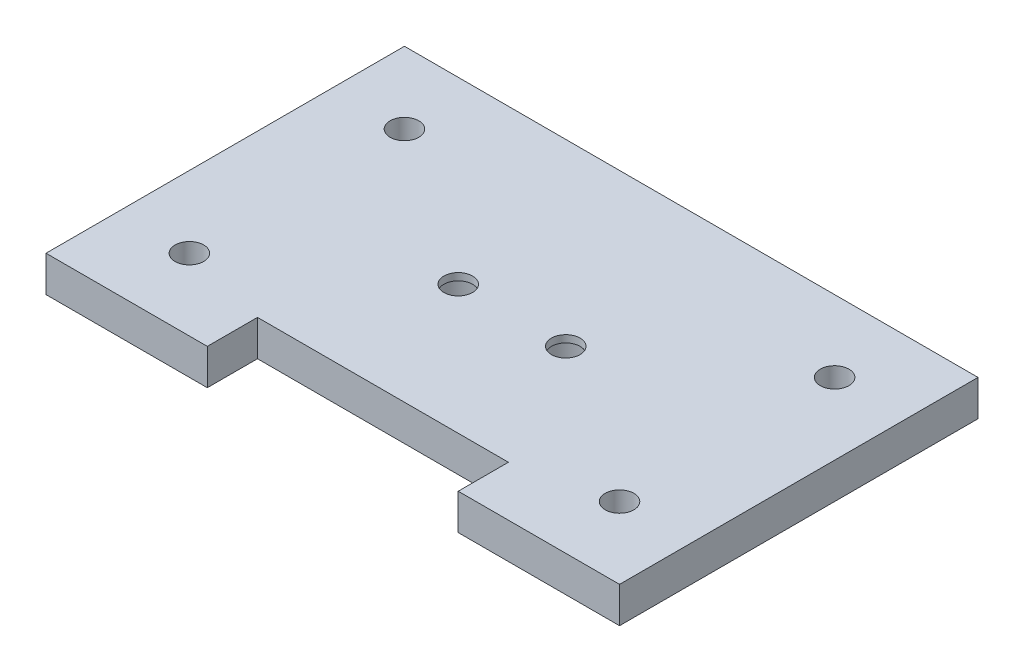
ISO-10303-21;
HEADER;
FILE_DESCRIPTION(('STEP AP214'),'2;1');
FILE_NAME('part.step','',(''),(''),'','','');
FILE_SCHEMA(('AUTOMOTIVE_DESIGN { 1 0 10303 214 1 1 1 1 }'));
ENDSEC;
DATA;
#1=APPLICATION_CONTEXT('core data for automotive mechanical design processes');
#2=APPLICATION_PROTOCOL_DEFINITION('international standard','automotive_design',2000,#1);
#3=PRODUCT_CONTEXT('',#1,'mechanical');
#4=PRODUCT('Part','Part','',(#3));
#5=PRODUCT_RELATED_PRODUCT_CATEGORY('part','',(#4));
#6=PRODUCT_DEFINITION_FORMATION('','',#4);
#7=PRODUCT_DEFINITION_CONTEXT('part definition',#1,'design');
#8=PRODUCT_DEFINITION('design','',#6,#7);
#9=PRODUCT_DEFINITION_SHAPE('','',#8);
#10=(LENGTH_UNIT() NAMED_UNIT(*) SI_UNIT(.MILLI.,.METRE.));
#11=(NAMED_UNIT(*) PLANE_ANGLE_UNIT() SI_UNIT($,.RADIAN.));
#12=(NAMED_UNIT(*) SI_UNIT($,.STERADIAN.) SOLID_ANGLE_UNIT());
#13=UNCERTAINTY_MEASURE_WITH_UNIT(LENGTH_MEASURE(1.E-05),#10,'distance_accuracy_value','');
#14=(GEOMETRIC_REPRESENTATION_CONTEXT(3) GLOBAL_UNCERTAINTY_ASSIGNED_CONTEXT((#13)) GLOBAL_UNIT_ASSIGNED_CONTEXT((#10,
#11,#12)) REPRESENTATION_CONTEXT('',''));
#15=CARTESIAN_POINT('',(0.,0.,0.));
#16=DIRECTION('',(0.,0.,1.));
#17=DIRECTION('',(1.,0.,0.));
#18=AXIS2_PLACEMENT_3D('',#15,#16,#17);
#19=CARTESIAN_POINT('',(-17.5000000000002,5.,1.38777878078146E-13));
#20=DIRECTION('',(-1.,0.,0.));
#21=DIRECTION('',(0.,0.,1.));
#22=AXIS2_PLACEMENT_3D('',#19,#20,#21);
#23=PLANE('',#22);
#24=DIRECTION('',(0.,0.,-1.));
#25=VECTOR('',#24,1.);
#26=CARTESIAN_POINT('',(-17.5000000000002,0.,1.38777878078146E-13));
#27=LINE('',#26,#25);
#28=CARTESIAN_POINT('',(-17.5,0.,25.));
#29=VERTEX_POINT('',#28);
#30=CARTESIAN_POINT('',(-17.5,0.,18.));
#31=VERTEX_POINT('',#30);
#32=EDGE_CURVE('E152',#29,#31,#27,.T.);
#33=ORIENTED_EDGE('',*,*,#32,.T.);
#34=DIRECTION('',(0.,-1.,0.));
#35=VECTOR('',#34,1.);
#36=CARTESIAN_POINT('',(-17.5,5.,18.));
#37=LINE('',#36,#35);
#38=CARTESIAN_POINT('',(-17.5,5.,18.));
#39=VERTEX_POINT('',#38);
#40=EDGE_CURVE('E11',#39,#31,#37,.T.);
#41=ORIENTED_EDGE('',*,*,#40,.F.);
#42=DIRECTION('',(0.,0.,-1.));
#43=VECTOR('',#42,1.);
#44=CARTESIAN_POINT('',(-17.5000000000002,5.,1.38777878078146E-13));
#45=LINE('',#44,#43);
#46=CARTESIAN_POINT('',(-17.5,5.,25.));
#47=VERTEX_POINT('',#46);
#48=EDGE_CURVE('E214',#47,#39,#45,.T.);
#49=ORIENTED_EDGE('',*,*,#48,.F.);
#50=DIRECTION('',(0.,-1.,0.));
#51=VECTOR('',#50,1.);
#52=CARTESIAN_POINT('',(-17.5,5.,25.));
#53=LINE('',#52,#51);
#54=EDGE_CURVE('E169',#47,#29,#53,.T.);
#55=ORIENTED_EDGE('',*,*,#54,.T.);
#56=EDGE_LOOP('',(#33,#41,#49,#55));
#57=FACE_BOUND('',#56,.T.);
#58=ADVANCED_FACE('F41',(#57),#23,.F.);
#59=CARTESIAN_POINT('',(0.,5.,18.));
#60=DIRECTION('',(0.,0.,-1.));
#61=DIRECTION('',(-1.,0.,0.));
#62=AXIS2_PLACEMENT_3D('',#59,#60,#61);
#63=PLANE('',#62);
#64=DIRECTION('',(1.,0.,0.));
#65=VECTOR('',#64,1.);
#66=CARTESIAN_POINT('',(0.,0.,18.));
#67=LINE('',#66,#65);
#68=CARTESIAN_POINT('',(17.5,0.,18.));
#69=VERTEX_POINT('',#68);
#70=EDGE_CURVE('E155',#31,#69,#67,.T.);
#71=ORIENTED_EDGE('',*,*,#70,.T.);
#72=DIRECTION('',(0.,-1.,0.));
#73=VECTOR('',#72,1.);
#74=CARTESIAN_POINT('',(17.5,5.,18.));
#75=LINE('',#74,#73);
#76=CARTESIAN_POINT('',(17.5,5.,18.));
#77=VERTEX_POINT('',#76);
#78=EDGE_CURVE('E51',#77,#69,#75,.T.);
#79=ORIENTED_EDGE('',*,*,#78,.F.);
#80=DIRECTION('',(1.,0.,0.));
#81=VECTOR('',#80,1.);
#82=CARTESIAN_POINT('',(0.,5.,18.));
#83=LINE('',#82,#81);
#84=EDGE_CURVE('E102',#39,#77,#83,.T.);
#85=ORIENTED_EDGE('',*,*,#84,.F.);
#86=ORIENTED_EDGE('',*,*,#40,.T.);
#87=EDGE_LOOP('',(#71,#79,#85,#86));
#88=FACE_BOUND('',#87,.T.);
#89=ADVANCED_FACE('F249',(#88),#63,.F.);
#90=CARTESIAN_POINT('',(17.5,5.,0.));
#91=DIRECTION('',(-1.,0.,0.));
#92=DIRECTION('',(0.,0.,1.));
#93=AXIS2_PLACEMENT_3D('',#90,#91,#92);
#94=PLANE('',#93);
#95=DIRECTION('',(0.,0.,-1.));
#96=VECTOR('',#95,1.);
#97=CARTESIAN_POINT('',(17.5,0.,0.));
#98=LINE('',#97,#96);
#99=CARTESIAN_POINT('',(17.5,0.,25.));
#100=VERTEX_POINT('',#99);
#101=EDGE_CURVE('E158',#100,#69,#98,.T.);
#102=ORIENTED_EDGE('',*,*,#101,.F.);
#103=DIRECTION('',(0.,-1.,0.));
#104=VECTOR('',#103,1.);
#105=CARTESIAN_POINT('',(17.5,5.,25.));
#106=LINE('',#105,#104);
#107=CARTESIAN_POINT('',(17.5,5.,25.));
#108=VERTEX_POINT('',#107);
#109=EDGE_CURVE('E175',#108,#100,#106,.T.);
#110=ORIENTED_EDGE('',*,*,#109,.F.);
#111=DIRECTION('',(0.,0.,-1.));
#112=VECTOR('',#111,1.);
#113=CARTESIAN_POINT('',(17.5,5.,0.));
#114=LINE('',#113,#112);
#115=EDGE_CURVE('E217',#108,#77,#114,.T.);
#116=ORIENTED_EDGE('',*,*,#115,.T.);
#117=ORIENTED_EDGE('',*,*,#78,.T.);
#118=EDGE_LOOP('',(#102,#110,#116,#117));
#119=FACE_BOUND('',#118,.T.);
#120=ADVANCED_FACE('F247',(#119),#94,.T.);
#121=CARTESIAN_POINT('',(0.,5.,25.));
#122=DIRECTION('',(0.,0.,-1.));
#123=DIRECTION('',(-1.,0.,0.));
#124=AXIS2_PLACEMENT_3D('',#121,#122,#123);
#125=PLANE('',#124);
#126=DIRECTION('',(1.,0.,0.));
#127=VECTOR('',#126,1.);
#128=CARTESIAN_POINT('',(0.,0.,25.));
#129=LINE('',#128,#127);
#130=CARTESIAN_POINT('',(40.,0.,25.));
#131=VERTEX_POINT('',#130);
#132=EDGE_CURVE('E161',#100,#131,#129,.T.);
#133=ORIENTED_EDGE('',*,*,#132,.T.);
#134=DIRECTION('',(0.,-1.,0.));
#135=VECTOR('',#134,1.);
#136=CARTESIAN_POINT('',(40.,5.,25.));
#137=LINE('',#136,#135);
#138=CARTESIAN_POINT('',(40.,5.,25.));
#139=VERTEX_POINT('',#138);
#140=EDGE_CURVE('E173',#139,#131,#137,.T.);
#141=ORIENTED_EDGE('',*,*,#140,.F.);
#142=DIRECTION('',(1.,0.,0.));
#143=VECTOR('',#142,1.);
#144=CARTESIAN_POINT('',(0.,5.,25.));
#145=LINE('',#144,#143);
#146=EDGE_CURVE('E135',#108,#139,#145,.T.);
#147=ORIENTED_EDGE('',*,*,#146,.F.);
#148=ORIENTED_EDGE('',*,*,#109,.T.);
#149=EDGE_LOOP('',(#133,#141,#147,#148));
#150=FACE_BOUND('',#149,.T.);
#151=ADVANCED_FACE('F223',(#150),#125,.F.);
#152=CARTESIAN_POINT('',(40.,5.,0.));
#153=DIRECTION('',(1.,0.,0.));
#154=DIRECTION('',(0.,0.,-1.));
#155=AXIS2_PLACEMENT_3D('',#152,#153,#154);
#156=PLANE('',#155);
#157=DIRECTION('',(0.,0.,1.));
#158=VECTOR('',#157,1.);
#159=CARTESIAN_POINT('',(40.,0.,0.));
#160=LINE('',#159,#158);
#161=CARTESIAN_POINT('',(40.,0.,-25.));
#162=VERTEX_POINT('',#161);
#163=EDGE_CURVE('E164',#162,#131,#160,.T.);
#164=ORIENTED_EDGE('',*,*,#163,.F.);
#165=DIRECTION('',(0.,-1.,0.));
#166=VECTOR('',#165,1.);
#167=CARTESIAN_POINT('',(40.,5.,-25.));
#168=LINE('',#167,#166);
#169=CARTESIAN_POINT('',(40.,5.,-25.));
#170=VERTEX_POINT('',#169);
#171=EDGE_CURVE('E124',#170,#162,#168,.T.);
#172=ORIENTED_EDGE('',*,*,#171,.F.);
#173=DIRECTION('',(0.,0.,1.));
#174=VECTOR('',#173,1.);
#175=CARTESIAN_POINT('',(40.,5.,0.));
#176=LINE('',#175,#174);
#177=EDGE_CURVE('E133',#170,#139,#176,.T.);
#178=ORIENTED_EDGE('',*,*,#177,.T.);
#179=ORIENTED_EDGE('',*,*,#140,.T.);
#180=EDGE_LOOP('',(#164,#172,#178,#179));
#181=FACE_BOUND('',#180,.T.);
#182=ADVANCED_FACE('F227',(#181),#156,.T.);
#183=CARTESIAN_POINT('',(0.,5.,-25.));
#184=DIRECTION('',(0.,0.,-1.));
#185=DIRECTION('',(-1.,0.,0.));
#186=AXIS2_PLACEMENT_3D('',#183,#184,#185);
#187=PLANE('',#186);
#188=DIRECTION('',(1.,0.,0.));
#189=VECTOR('',#188,1.);
#190=CARTESIAN_POINT('',(0.,0.,-25.));
#191=LINE('',#190,#189);
#192=CARTESIAN_POINT('',(-40.,0.,-25.));
#193=VERTEX_POINT('',#192);
#194=EDGE_CURVE('E123',#193,#162,#191,.T.);
#195=ORIENTED_EDGE('',*,*,#194,.F.);
#196=DIRECTION('',(0.,-1.,0.));
#197=VECTOR('',#196,1.);
#198=CARTESIAN_POINT('',(-40.,5.,-25.));
#199=LINE('',#198,#197);
#200=CARTESIAN_POINT('',(-40.,5.,-25.));
#201=VERTEX_POINT('',#200);
#202=EDGE_CURVE('E117',#201,#193,#199,.T.);
#203=ORIENTED_EDGE('',*,*,#202,.F.);
#204=DIRECTION('',(1.,0.,0.));
#205=VECTOR('',#204,1.);
#206=CARTESIAN_POINT('',(0.,5.,-25.));
#207=LINE('',#206,#205);
#208=EDGE_CURVE('E121',#201,#170,#207,.T.);
#209=ORIENTED_EDGE('',*,*,#208,.T.);
#210=ORIENTED_EDGE('',*,*,#171,.T.);
#211=EDGE_LOOP('',(#195,#203,#209,#210));
#212=FACE_BOUND('',#211,.T.);
#213=ADVANCED_FACE('F119',(#212),#187,.T.);
#214=CARTESIAN_POINT('',(-40.,5.,0.));
#215=DIRECTION('',(1.,0.,0.));
#216=DIRECTION('',(0.,0.,-1.));
#217=AXIS2_PLACEMENT_3D('',#214,#215,#216);
#218=PLANE('',#217);
#219=DIRECTION('',(0.,0.,1.));
#220=VECTOR('',#219,1.);
#221=CARTESIAN_POINT('',(-40.,0.,0.));
#222=LINE('',#221,#220);
#223=CARTESIAN_POINT('',(-40.,0.,25.));
#224=VERTEX_POINT('',#223);
#225=EDGE_CURVE('E88',#193,#224,#222,.T.);
#226=ORIENTED_EDGE('',*,*,#225,.T.);
#227=DIRECTION('',(0.,-1.,0.));
#228=VECTOR('',#227,1.);
#229=CARTESIAN_POINT('',(-40.,5.,25.));
#230=LINE('',#229,#228);
#231=CARTESIAN_POINT('',(-40.,5.,25.));
#232=VERTEX_POINT('',#231);
#233=EDGE_CURVE('E125',#232,#224,#230,.T.);
#234=ORIENTED_EDGE('',*,*,#233,.F.);
#235=DIRECTION('',(0.,0.,1.));
#236=VECTOR('',#235,1.);
#237=CARTESIAN_POINT('',(-40.,5.,0.));
#238=LINE('',#237,#236);
#239=EDGE_CURVE('E127',#201,#232,#238,.T.);
#240=ORIENTED_EDGE('',*,*,#239,.F.);
#241=ORIENTED_EDGE('',*,*,#202,.T.);
#242=EDGE_LOOP('',(#226,#234,#240,#241));
#243=FACE_BOUND('',#242,.T.);
#244=ADVANCED_FACE('F128',(#243),#218,.F.);
#245=CARTESIAN_POINT('',(-30.,5.,-15.));
#246=DIRECTION('',(0.,-1.,0.));
#247=DIRECTION('',(0.,0.,-1.));
#248=AXIS2_PLACEMENT_3D('',#245,#246,#247);
#249=CYLINDRICAL_SURFACE('',#248,2.);
#250=CARTESIAN_POINT('',(-30.,5.,-15.));
#251=DIRECTION('',(0.,1.,0.));
#252=DIRECTION('',(0.,0.,1.));
#253=AXIS2_PLACEMENT_3D('',#250,#251,#252);
#254=CIRCLE('',#253,2.);
#255=CARTESIAN_POINT('',(-30.,5.,-13.));
#256=VERTEX_POINT('',#255);
#257=EDGE_CURVE('E211',#256,#256,#254,.T.);
#258=ORIENTED_EDGE('',*,*,#257,.T.);
#259=EDGE_LOOP('',(#258));
#260=FACE_BOUND('',#259,.T.);
#261=CARTESIAN_POINT('',(-30.,0.,-15.));
#262=DIRECTION('',(0.,1.,0.));
#263=DIRECTION('',(0.,0.,1.));
#264=AXIS2_PLACEMENT_3D('',#261,#262,#263);
#265=CIRCLE('',#264,2.);
#266=CARTESIAN_POINT('',(-30.,0.,-13.));
#267=VERTEX_POINT('',#266);
#268=EDGE_CURVE('E149',#267,#267,#265,.T.);
#269=ORIENTED_EDGE('',*,*,#268,.F.);
#270=EDGE_LOOP('',(#269));
#271=FACE_BOUND('',#270,.T.);
#272=ADVANCED_FACE('F257',(#260,#271),#249,.F.);
#273=CARTESIAN_POINT('',(30.,5.,-15.));
#274=DIRECTION('',(0.,-1.,0.));
#275=DIRECTION('',(0.,0.,-1.));
#276=AXIS2_PLACEMENT_3D('',#273,#274,#275);
#277=CYLINDRICAL_SURFACE('',#276,2.);
#278=CARTESIAN_POINT('',(30.,5.,-15.));
#279=DIRECTION('',(0.,1.,0.));
#280=DIRECTION('',(0.,0.,1.));
#281=AXIS2_PLACEMENT_3D('',#278,#279,#280);
#282=CIRCLE('',#281,2.);
#283=CARTESIAN_POINT('',(30.,5.,-13.));
#284=VERTEX_POINT('',#283);
#285=EDGE_CURVE('E208',#284,#284,#282,.T.);
#286=ORIENTED_EDGE('',*,*,#285,.T.);
#287=EDGE_LOOP('',(#286));
#288=FACE_BOUND('',#287,.T.);
#289=CARTESIAN_POINT('',(30.,0.,-15.));
#290=DIRECTION('',(0.,1.,0.));
#291=DIRECTION('',(0.,0.,1.));
#292=AXIS2_PLACEMENT_3D('',#289,#290,#291);
#293=CIRCLE('',#292,2.);
#294=CARTESIAN_POINT('',(30.,0.,-13.));
#295=VERTEX_POINT('',#294);
#296=EDGE_CURVE('E146',#295,#295,#293,.T.);
#297=ORIENTED_EDGE('',*,*,#296,.F.);
#298=EDGE_LOOP('',(#297));
#299=FACE_BOUND('',#298,.T.);
#300=ADVANCED_FACE('F260',(#288,#299),#277,.F.);
#301=CARTESIAN_POINT('',(30.,5.,15.));
#302=DIRECTION('',(0.,-1.,0.));
#303=DIRECTION('',(0.,0.,-1.));
#304=AXIS2_PLACEMENT_3D('',#301,#302,#303);
#305=CYLINDRICAL_SURFACE('',#304,2.);
#306=CARTESIAN_POINT('',(30.,5.,15.));
#307=DIRECTION('',(0.,1.,0.));
#308=DIRECTION('',(0.,0.,1.));
#309=AXIS2_PLACEMENT_3D('',#306,#307,#308);
#310=CIRCLE('',#309,2.);
#311=CARTESIAN_POINT('',(30.,5.,17.));
#312=VERTEX_POINT('',#311);
#313=EDGE_CURVE('E205',#312,#312,#310,.T.);
#314=ORIENTED_EDGE('',*,*,#313,.T.);
#315=EDGE_LOOP('',(#314));
#316=FACE_BOUND('',#315,.T.);
#317=CARTESIAN_POINT('',(30.,0.,15.));
#318=DIRECTION('',(0.,1.,0.));
#319=DIRECTION('',(0.,0.,1.));
#320=AXIS2_PLACEMENT_3D('',#317,#318,#319);
#321=CIRCLE('',#320,2.);
#322=CARTESIAN_POINT('',(30.,0.,17.));
#323=VERTEX_POINT('',#322);
#324=EDGE_CURVE('E142',#323,#323,#321,.T.);
#325=ORIENTED_EDGE('',*,*,#324,.F.);
#326=EDGE_LOOP('',(#325));
#327=FACE_BOUND('',#326,.T.);
#328=ADVANCED_FACE('F242',(#316,#327),#305,.F.);
#329=CARTESIAN_POINT('',(-30.,5.,15.));
#330=DIRECTION('',(0.,-1.,0.));
#331=DIRECTION('',(0.,0.,-1.));
#332=AXIS2_PLACEMENT_3D('',#329,#330,#331);
#333=CYLINDRICAL_SURFACE('',#332,2.);
#334=CARTESIAN_POINT('',(-30.,5.,15.));
#335=DIRECTION('',(0.,1.,0.));
#336=DIRECTION('',(0.,0.,1.));
#337=AXIS2_PLACEMENT_3D('',#334,#335,#336);
#338=CIRCLE('',#337,2.);
#339=CARTESIAN_POINT('',(-30.,5.,17.));
#340=VERTEX_POINT('',#339);
#341=EDGE_CURVE('E202',#340,#340,#338,.T.);
#342=ORIENTED_EDGE('',*,*,#341,.T.);
#343=EDGE_LOOP('',(#342));
#344=FACE_BOUND('',#343,.T.);
#345=CARTESIAN_POINT('',(-30.,0.,15.));
#346=DIRECTION('',(0.,1.,0.));
#347=DIRECTION('',(0.,0.,1.));
#348=AXIS2_PLACEMENT_3D('',#345,#346,#347);
#349=CIRCLE('',#348,2.);
#350=CARTESIAN_POINT('',(-30.,0.,17.));
#351=VERTEX_POINT('',#350);
#352=EDGE_CURVE('E139',#351,#351,#349,.T.);
#353=ORIENTED_EDGE('',*,*,#352,.F.);
#354=EDGE_LOOP('',(#353));
#355=FACE_BOUND('',#354,.T.);
#356=ADVANCED_FACE('F43',(#344,#355),#333,.F.);
#357=EDGE_CURVE('E94',#224,#29,#129,.T.);
#358=ORIENTED_EDGE('',*,*,#357,.T.);
#359=ORIENTED_EDGE('',*,*,#54,.F.);
#360=EDGE_CURVE('E60',#232,#47,#145,.T.);
#361=ORIENTED_EDGE('',*,*,#360,.F.);
#362=ORIENTED_EDGE('',*,*,#233,.T.);
#363=EDGE_LOOP('',(#358,#359,#361,#362));
#364=FACE_BOUND('',#363,.T.);
#365=ADVANCED_FACE('F234',(#364),#125,.F.);
#366=CARTESIAN_POINT('',(0.,5.,0.));
#367=DIRECTION('',(0.,1.,0.));
#368=DIRECTION('',(0.,0.,1.));
#369=AXIS2_PLACEMENT_3D('',#366,#367,#368);
#370=PLANE('',#369);
#371=CARTESIAN_POINT('',(-7.5,5.,0.));
#372=DIRECTION('',(0.,-1.,0.));
#373=DIRECTION('',(0.,0.,-1.));
#374=AXIS2_PLACEMENT_3D('',#371,#372,#373);
#375=CIRCLE('',#374,2.);
#376=CARTESIAN_POINT('',(-7.5,5.,-2.));
#377=VERTEX_POINT('',#376);
#378=EDGE_CURVE('E179',#377,#377,#375,.T.);
#379=ORIENTED_EDGE('',*,*,#378,.T.);
#380=EDGE_LOOP('',(#379));
#381=FACE_BOUND('',#380,.T.);
#382=CARTESIAN_POINT('',(7.5,5.,0.));
#383=DIRECTION('',(0.,-1.,0.));
#384=DIRECTION('',(0.,0.,-1.));
#385=AXIS2_PLACEMENT_3D('',#382,#383,#384);
#386=CIRCLE('',#385,2.);
#387=CARTESIAN_POINT('',(7.5,5.,-2.));
#388=VERTEX_POINT('',#387);
#389=EDGE_CURVE('E185',#388,#388,#386,.T.);
#390=ORIENTED_EDGE('',*,*,#389,.T.);
#391=EDGE_LOOP('',(#390));
#392=FACE_BOUND('',#391,.T.);
#393=ORIENTED_EDGE('',*,*,#341,.F.);
#394=EDGE_LOOP('',(#393));
#395=FACE_BOUND('',#394,.T.);
#396=ORIENTED_EDGE('',*,*,#313,.F.);
#397=EDGE_LOOP('',(#396));
#398=FACE_BOUND('',#397,.T.);
#399=ORIENTED_EDGE('',*,*,#285,.F.);
#400=EDGE_LOOP('',(#399));
#401=FACE_BOUND('',#400,.T.);
#402=ORIENTED_EDGE('',*,*,#257,.F.);
#403=EDGE_LOOP('',(#402));
#404=FACE_BOUND('',#403,.T.);
#405=ORIENTED_EDGE('',*,*,#48,.T.);
#406=ORIENTED_EDGE('',*,*,#84,.T.);
#407=ORIENTED_EDGE('',*,*,#115,.F.);
#408=ORIENTED_EDGE('',*,*,#146,.T.);
#409=ORIENTED_EDGE('',*,*,#177,.F.);
#410=ORIENTED_EDGE('',*,*,#208,.F.);
#411=ORIENTED_EDGE('',*,*,#239,.T.);
#412=ORIENTED_EDGE('',*,*,#360,.T.);
#413=EDGE_LOOP('',(#405,#406,#407,#408,#409,#410,#411,#412));
#414=FACE_BOUND('',#413,.T.);
#415=ADVANCED_FACE('F131',(#381,#392,#395,#398,#401,#404,#414),#370,.T.);
#416=CARTESIAN_POINT('',(0.,0.,0.));
#417=DIRECTION('',(0.,1.,0.));
#418=DIRECTION('',(0.,0.,1.));
#419=AXIS2_PLACEMENT_3D('',#416,#417,#418);
#420=PLANE('',#419);
#421=CARTESIAN_POINT('',(-7.5,0.,0.));
#422=DIRECTION('',(0.,-1.,0.));
#423=DIRECTION('',(0.,0.,-1.));
#424=AXIS2_PLACEMENT_3D('',#421,#422,#423);
#425=CIRCLE('',#424,4.);
#426=CARTESIAN_POINT('',(-7.5,0.,-4.));
#427=VERTEX_POINT('',#426);
#428=EDGE_CURVE('E194',#427,#427,#425,.T.);
#429=ORIENTED_EDGE('',*,*,#428,.F.);
#430=EDGE_LOOP('',(#429));
#431=FACE_BOUND('',#430,.T.);
#432=CARTESIAN_POINT('',(7.5,0.,0.));
#433=DIRECTION('',(0.,-1.,0.));
#434=DIRECTION('',(0.,0.,-1.));
#435=AXIS2_PLACEMENT_3D('',#432,#433,#434);
#436=CIRCLE('',#435,4.);
#437=CARTESIAN_POINT('',(7.5,0.,-4.));
#438=VERTEX_POINT('',#437);
#439=EDGE_CURVE('E183',#438,#438,#436,.T.);
#440=ORIENTED_EDGE('',*,*,#439,.F.);
#441=EDGE_LOOP('',(#440));
#442=FACE_BOUND('',#441,.T.);
#443=ORIENTED_EDGE('',*,*,#352,.T.);
#444=EDGE_LOOP('',(#443));
#445=FACE_BOUND('',#444,.T.);
#446=ORIENTED_EDGE('',*,*,#324,.T.);
#447=EDGE_LOOP('',(#446));
#448=FACE_BOUND('',#447,.T.);
#449=ORIENTED_EDGE('',*,*,#296,.T.);
#450=EDGE_LOOP('',(#449));
#451=FACE_BOUND('',#450,.T.);
#452=ORIENTED_EDGE('',*,*,#268,.T.);
#453=EDGE_LOOP('',(#452));
#454=FACE_BOUND('',#453,.T.);
#455=ORIENTED_EDGE('',*,*,#32,.F.);
#456=ORIENTED_EDGE('',*,*,#357,.F.);
#457=ORIENTED_EDGE('',*,*,#225,.F.);
#458=ORIENTED_EDGE('',*,*,#194,.T.);
#459=ORIENTED_EDGE('',*,*,#163,.T.);
#460=ORIENTED_EDGE('',*,*,#132,.F.);
#461=ORIENTED_EDGE('',*,*,#101,.T.);
#462=ORIENTED_EDGE('',*,*,#70,.F.);
#463=EDGE_LOOP('',(#455,#456,#457,#458,#459,#460,#461,#462));
#464=FACE_BOUND('',#463,.T.);
#465=ADVANCED_FACE('F230',(#431,#442,#445,#448,#451,#454,#464),#420,.F.);
#466=CARTESIAN_POINT('',(7.5,4.,0.));
#467=DIRECTION('',(0.,-1.,0.));
#468=DIRECTION('',(0.,0.,-1.));
#469=AXIS2_PLACEMENT_3D('',#466,#467,#468);
#470=CYLINDRICAL_SURFACE('',#469,4.);
#471=CARTESIAN_POINT('',(7.5,4.,0.));
#472=DIRECTION('',(0.,-1.,0.));
#473=DIRECTION('',(0.,0.,-1.));
#474=AXIS2_PLACEMENT_3D('',#471,#472,#473);
#475=CIRCLE('',#474,4.);
#476=CARTESIAN_POINT('',(7.5,4.,-4.));
#477=VERTEX_POINT('',#476);
#478=EDGE_CURVE('E197',#477,#477,#475,.T.);
#479=ORIENTED_EDGE('',*,*,#478,.F.);
#480=EDGE_LOOP('',(#479));
#481=FACE_BOUND('',#480,.T.);
#482=ORIENTED_EDGE('',*,*,#439,.T.);
#483=EDGE_LOOP('',(#482));
#484=FACE_BOUND('',#483,.T.);
#485=ADVANCED_FACE('F274',(#481,#484),#470,.F.);
#486=CARTESIAN_POINT('',(0.,4.,0.));
#487=DIRECTION('',(0.,-1.,0.));
#488=DIRECTION('',(0.,0.,-1.));
#489=AXIS2_PLACEMENT_3D('',#486,#487,#488);
#490=PLANE('',#489);
#491=CARTESIAN_POINT('',(7.5,4.,0.));
#492=DIRECTION('',(0.,-1.,0.));
#493=DIRECTION('',(0.,0.,-1.));
#494=AXIS2_PLACEMENT_3D('',#491,#492,#493);
#495=CIRCLE('',#494,2.);
#496=CARTESIAN_POINT('',(7.5,4.,-2.));
#497=VERTEX_POINT('',#496);
#498=EDGE_CURVE('E45',#497,#497,#495,.T.);
#499=ORIENTED_EDGE('',*,*,#498,.F.);
#500=EDGE_LOOP('',(#499));
#501=FACE_BOUND('',#500,.T.);
#502=ORIENTED_EDGE('',*,*,#478,.T.);
#503=EDGE_LOOP('',(#502));
#504=FACE_BOUND('',#503,.T.);
#505=ADVANCED_FACE('F284',(#501,#504),#490,.T.);
#506=CARTESIAN_POINT('',(-7.5,4.,0.));
#507=DIRECTION('',(0.,-1.,0.));
#508=DIRECTION('',(0.,0.,-1.));
#509=AXIS2_PLACEMENT_3D('',#506,#507,#508);
#510=CYLINDRICAL_SURFACE('',#509,4.);
#511=CARTESIAN_POINT('',(-7.5,4.,0.));
#512=DIRECTION('',(0.,-1.,0.));
#513=DIRECTION('',(0.,0.,-1.));
#514=AXIS2_PLACEMENT_3D('',#511,#512,#513);
#515=CIRCLE('',#514,4.);
#516=CARTESIAN_POINT('',(-7.5,4.,-4.));
#517=VERTEX_POINT('',#516);
#518=EDGE_CURVE('E143',#517,#517,#515,.T.);
#519=ORIENTED_EDGE('',*,*,#518,.F.);
#520=EDGE_LOOP('',(#519));
#521=FACE_BOUND('',#520,.T.);
#522=ORIENTED_EDGE('',*,*,#428,.T.);
#523=EDGE_LOOP('',(#522));
#524=FACE_BOUND('',#523,.T.);
#525=ADVANCED_FACE('F292',(#521,#524),#510,.F.);
#526=CARTESIAN_POINT('',(0.,4.,0.));
#527=DIRECTION('',(0.,-1.,0.));
#528=DIRECTION('',(0.,0.,-1.));
#529=AXIS2_PLACEMENT_3D('',#526,#527,#528);
#530=PLANE('',#529);
#531=CARTESIAN_POINT('',(-7.5,4.,0.));
#532=DIRECTION('',(0.,-1.,0.));
#533=DIRECTION('',(0.,0.,-1.));
#534=AXIS2_PLACEMENT_3D('',#531,#532,#533);
#535=CIRCLE('',#534,2.);
#536=CARTESIAN_POINT('',(-7.5,4.,-2.));
#537=VERTEX_POINT('',#536);
#538=EDGE_CURVE('E177',#537,#537,#535,.T.);
#539=ORIENTED_EDGE('',*,*,#538,.F.);
#540=EDGE_LOOP('',(#539));
#541=FACE_BOUND('',#540,.T.);
#542=ORIENTED_EDGE('',*,*,#518,.T.);
#543=EDGE_LOOP('',(#542));
#544=FACE_BOUND('',#543,.T.);
#545=ADVANCED_FACE('F296',(#541,#544),#530,.T.);
#546=CARTESIAN_POINT('',(-7.5,5.,0.));
#547=DIRECTION('',(0.,-1.,0.));
#548=DIRECTION('',(0.,0.,-1.));
#549=AXIS2_PLACEMENT_3D('',#546,#547,#548);
#550=CYLINDRICAL_SURFACE('',#549,2.);
#551=ORIENTED_EDGE('',*,*,#538,.T.);
#552=EDGE_LOOP('',(#551));
#553=FACE_BOUND('',#552,.T.);
#554=ORIENTED_EDGE('',*,*,#378,.F.);
#555=EDGE_LOOP('',(#554));
#556=FACE_BOUND('',#555,.T.);
#557=ADVANCED_FACE('F300',(#553,#556),#550,.F.);
#558=CARTESIAN_POINT('',(7.5,5.,0.));
#559=DIRECTION('',(0.,-1.,0.));
#560=DIRECTION('',(0.,0.,-1.));
#561=AXIS2_PLACEMENT_3D('',#558,#559,#560);
#562=CYLINDRICAL_SURFACE('',#561,2.);
#563=ORIENTED_EDGE('',*,*,#498,.T.);
#564=EDGE_LOOP('',(#563));
#565=FACE_BOUND('',#564,.T.);
#566=ORIENTED_EDGE('',*,*,#389,.F.);
#567=EDGE_LOOP('',(#566));
#568=FACE_BOUND('',#567,.T.);
#569=ADVANCED_FACE('F302',(#565,#568),#562,.F.);
#570=CLOSED_SHELL('',(#58,#89,#120,#151,#182,#213,#244,#272,#300,#328,#356,#365,#415,#465,#485,
#505,#525,#545,#557,#569));
#571=MANIFOLD_SOLID_BREP('B2',#570);
#572=ADVANCED_BREP_SHAPE_REPRESENTATION('',(#18,#571),#14);
#573=SHAPE_DEFINITION_REPRESENTATION(#9,#572);
ENDSEC;
END-ISO-10303-21;
